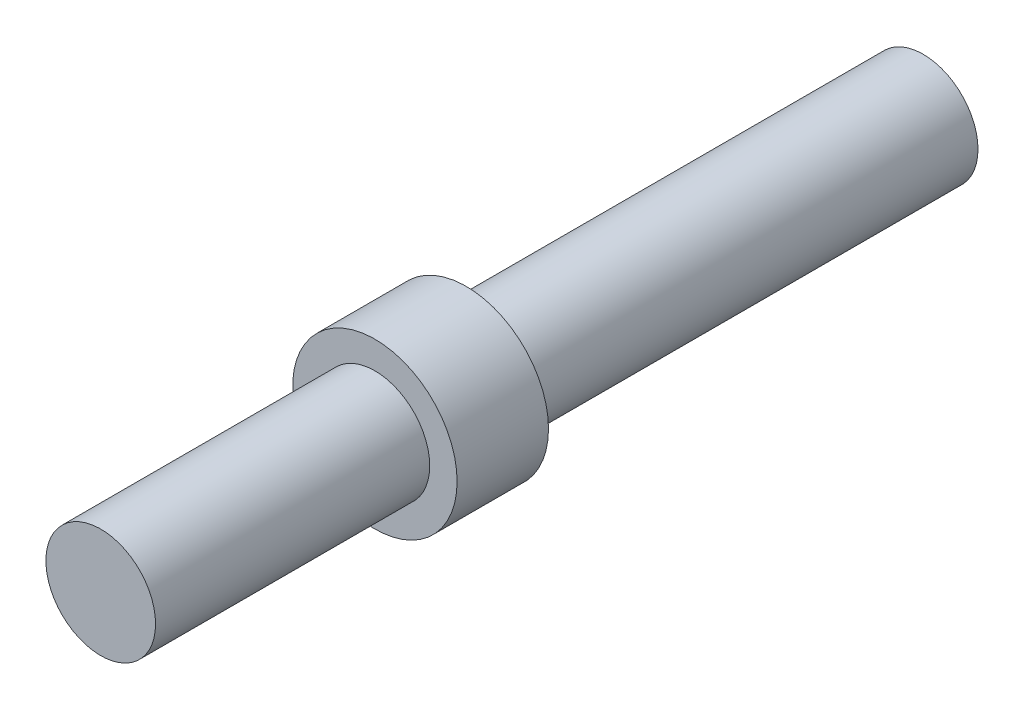
ISO-10303-21;
HEADER;
FILE_DESCRIPTION(('STEP AP214'),'2;1');
FILE_NAME('part.step','',(''),(''),'','','');
FILE_SCHEMA(('AUTOMOTIVE_DESIGN { 1 0 10303 214 1 1 1 1 }'));
ENDSEC;
DATA;
#1=APPLICATION_CONTEXT('core data for automotive mechanical design processes');
#2=APPLICATION_PROTOCOL_DEFINITION('international standard','automotive_design',2000,#1);
#3=PRODUCT_CONTEXT('',#1,'mechanical');
#4=PRODUCT('Part','Part','',(#3));
#5=PRODUCT_RELATED_PRODUCT_CATEGORY('part','',(#4));
#6=PRODUCT_DEFINITION_FORMATION('','',#4);
#7=PRODUCT_DEFINITION_CONTEXT('part definition',#1,'design');
#8=PRODUCT_DEFINITION('design','',#6,#7);
#9=PRODUCT_DEFINITION_SHAPE('','',#8);
#10=(LENGTH_UNIT() NAMED_UNIT(*) SI_UNIT(.MILLI.,.METRE.));
#11=(NAMED_UNIT(*) PLANE_ANGLE_UNIT() SI_UNIT($,.RADIAN.));
#12=(NAMED_UNIT(*) SI_UNIT($,.STERADIAN.) SOLID_ANGLE_UNIT());
#13=UNCERTAINTY_MEASURE_WITH_UNIT(LENGTH_MEASURE(1.E-05),#10,'distance_accuracy_value','');
#14=(GEOMETRIC_REPRESENTATION_CONTEXT(3) GLOBAL_UNCERTAINTY_ASSIGNED_CONTEXT((#13)) GLOBAL_UNIT_ASSIGNED_CONTEXT((#10,
#11,#12)) REPRESENTATION_CONTEXT('',''));
#15=CARTESIAN_POINT('',(0.,0.,0.));
#16=DIRECTION('',(0.,0.,1.));
#17=DIRECTION('',(1.,0.,0.));
#18=AXIS2_PLACEMENT_3D('',#15,#16,#17);
#19=CARTESIAN_POINT('',(0.,0.,50.));
#20=DIRECTION('',(0.,0.,-1.));
#21=DIRECTION('',(-1.,0.,0.));
#22=AXIS2_PLACEMENT_3D('',#19,#20,#21);
#23=CYLINDRICAL_SURFACE('',#22,6.);
#24=CARTESIAN_POINT('',(0.,0.,50.));
#25=DIRECTION('',(0.,0.,1.));
#26=DIRECTION('',(1.,0.,0.));
#27=AXIS2_PLACEMENT_3D('',#24,#25,#26);
#28=CIRCLE('',#27,6.);
#29=CARTESIAN_POINT('',(6.,0.,50.));
#30=VERTEX_POINT('',#29);
#31=EDGE_CURVE('E42',#30,#30,#28,.T.);
#32=ORIENTED_EDGE('',*,*,#31,.F.);
#33=EDGE_LOOP('',(#32));
#34=FACE_BOUND('',#33,.T.);
#35=CARTESIAN_POINT('',(0.,0.,0.));
#36=DIRECTION('',(0.,0.,1.));
#37=DIRECTION('',(1.,0.,0.));
#38=AXIS2_PLACEMENT_3D('',#35,#36,#37);
#39=CIRCLE('',#38,6.);
#40=CARTESIAN_POINT('',(6.,0.,0.));
#41=VERTEX_POINT('',#40);
#42=EDGE_CURVE('E38',#41,#41,#39,.T.);
#43=ORIENTED_EDGE('',*,*,#42,.T.);
#44=EDGE_LOOP('',(#43));
#45=FACE_BOUND('',#44,.T.);
#46=ADVANCED_FACE('F35',(#34,#45),#23,.T.);
#47=CARTESIAN_POINT('',(0.,0.,0.));
#48=DIRECTION('',(0.,0.,1.));
#49=DIRECTION('',(1.,0.,0.));
#50=AXIS2_PLACEMENT_3D('',#47,#48,#49);
#51=PLANE('',#50);
#52=ORIENTED_EDGE('',*,*,#42,.F.);
#53=EDGE_LOOP('',(#52));
#54=FACE_BOUND('',#53,.T.);
#55=ADVANCED_FACE('F76',(#54),#51,.F.);
#56=CARTESIAN_POINT('',(0.,0.,60.));
#57=DIRECTION('',(0.,0.,-1.));
#58=DIRECTION('',(-1.,0.,0.));
#59=AXIS2_PLACEMENT_3D('',#56,#57,#58);
#60=CYLINDRICAL_SURFACE('',#59,9.);
#61=CARTESIAN_POINT('',(0.,0.,60.));
#62=DIRECTION('',(0.,0.,1.));
#63=DIRECTION('',(1.,0.,0.));
#64=AXIS2_PLACEMENT_3D('',#61,#62,#63);
#65=CIRCLE('',#64,9.);
#66=CARTESIAN_POINT('',(9.,0.,60.));
#67=VERTEX_POINT('',#66);
#68=EDGE_CURVE('E50',#67,#67,#65,.T.);
#69=ORIENTED_EDGE('',*,*,#68,.F.);
#70=EDGE_LOOP('',(#69));
#71=FACE_BOUND('',#70,.T.);
#72=CARTESIAN_POINT('',(0.,0.,50.));
#73=DIRECTION('',(0.,0.,1.));
#74=DIRECTION('',(1.,0.,0.));
#75=AXIS2_PLACEMENT_3D('',#72,#73,#74);
#76=CIRCLE('',#75,9.);
#77=CARTESIAN_POINT('',(9.,0.,50.));
#78=VERTEX_POINT('',#77);
#79=EDGE_CURVE('E53',#78,#78,#76,.T.);
#80=ORIENTED_EDGE('',*,*,#79,.T.);
#81=EDGE_LOOP('',(#80));
#82=FACE_BOUND('',#81,.T.);
#83=ADVANCED_FACE('F81',(#71,#82),#60,.T.);
#84=CARTESIAN_POINT('',(0.,0.,60.));
#85=DIRECTION('',(0.,0.,1.));
#86=DIRECTION('',(1.,0.,0.));
#87=AXIS2_PLACEMENT_3D('',#84,#85,#86);
#88=PLANE('',#87);
#89=CARTESIAN_POINT('',(0.,0.,60.));
#90=DIRECTION('',(0.,0.,1.));
#91=DIRECTION('',(1.,0.,0.));
#92=AXIS2_PLACEMENT_3D('',#89,#90,#91);
#93=CIRCLE('',#92,6.);
#94=CARTESIAN_POINT('',(6.,0.,60.));
#95=VERTEX_POINT('',#94);
#96=EDGE_CURVE('E10',#95,#95,#93,.T.);
#97=ORIENTED_EDGE('',*,*,#96,.F.);
#98=EDGE_LOOP('',(#97));
#99=FACE_BOUND('',#98,.T.);
#100=ORIENTED_EDGE('',*,*,#68,.T.);
#101=EDGE_LOOP('',(#100));
#102=FACE_BOUND('',#101,.T.);
#103=ADVANCED_FACE('F71',(#99,#102),#88,.T.);
#104=CARTESIAN_POINT('',(0.,0.,50.));
#105=DIRECTION('',(0.,0.,1.));
#106=DIRECTION('',(1.,0.,0.));
#107=AXIS2_PLACEMENT_3D('',#104,#105,#106);
#108=PLANE('',#107);
#109=ORIENTED_EDGE('',*,*,#31,.T.);
#110=EDGE_LOOP('',(#109));
#111=FACE_BOUND('',#110,.T.);
#112=ORIENTED_EDGE('',*,*,#79,.F.);
#113=EDGE_LOOP('',(#112));
#114=FACE_BOUND('',#113,.T.);
#115=ADVANCED_FACE('F64',(#111,#114),#108,.F.);
#116=CARTESIAN_POINT('',(0.,0.,90.));
#117=DIRECTION('',(0.,0.,-1.));
#118=DIRECTION('',(-1.,0.,0.));
#119=AXIS2_PLACEMENT_3D('',#116,#117,#118);
#120=CYLINDRICAL_SURFACE('',#119,6.);
#121=CARTESIAN_POINT('',(0.,0.,90.));
#122=DIRECTION('',(0.,0.,1.));
#123=DIRECTION('',(1.,0.,0.));
#124=AXIS2_PLACEMENT_3D('',#121,#122,#123);
#125=CIRCLE('',#124,6.);
#126=CARTESIAN_POINT('',(6.,0.,90.));
#127=VERTEX_POINT('',#126);
#128=EDGE_CURVE('E49',#127,#127,#125,.T.);
#129=ORIENTED_EDGE('',*,*,#128,.F.);
#130=EDGE_LOOP('',(#129));
#131=FACE_BOUND('',#130,.T.);
#132=ORIENTED_EDGE('',*,*,#96,.T.);
#133=EDGE_LOOP('',(#132));
#134=FACE_BOUND('',#133,.T.);
#135=ADVANCED_FACE('F62',(#131,#134),#120,.T.);
#136=CARTESIAN_POINT('',(0.,0.,90.));
#137=DIRECTION('',(0.,0.,1.));
#138=DIRECTION('',(1.,0.,0.));
#139=AXIS2_PLACEMENT_3D('',#136,#137,#138);
#140=PLANE('',#139);
#141=ORIENTED_EDGE('',*,*,#128,.T.);
#142=EDGE_LOOP('',(#141));
#143=FACE_BOUND('',#142,.T.);
#144=ADVANCED_FACE('F60',(#143),#140,.T.);
#145=CLOSED_SHELL('',(#46,#55,#83,#103,#115,#135,#144));
#146=MANIFOLD_SOLID_BREP('B2',#145);
#147=ADVANCED_BREP_SHAPE_REPRESENTATION('',(#18,#146),#14);
#148=SHAPE_DEFINITION_REPRESENTATION(#9,#147);
ENDSEC;
END-ISO-10303-21;
